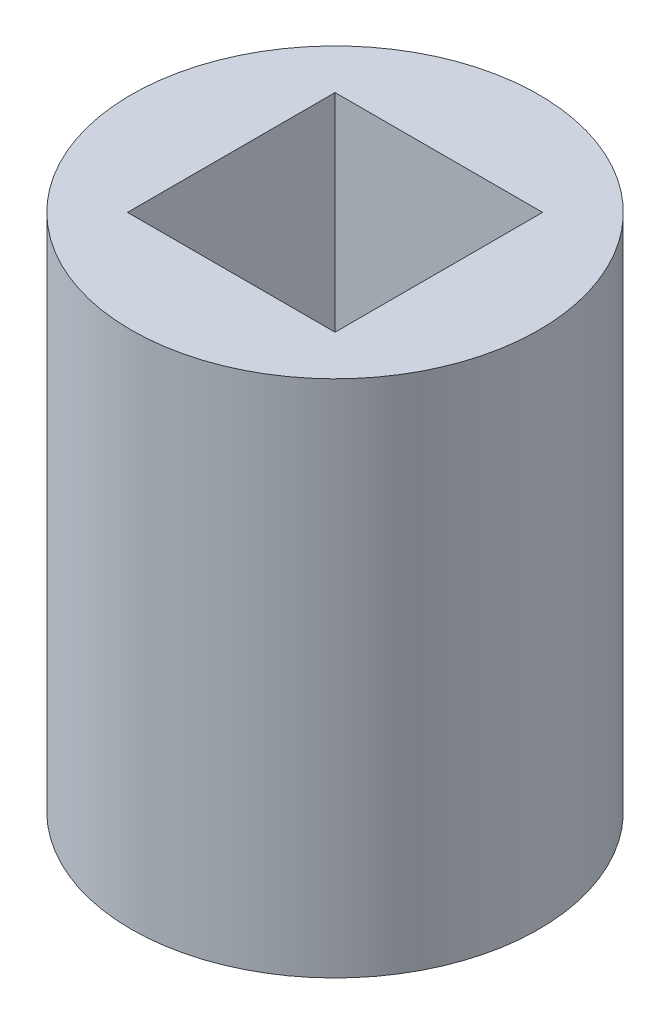
ISO-10303-21;
HEADER;
FILE_DESCRIPTION(('STEP AP214'),'2;1');
FILE_NAME('part.step','',(''),(''),'','','');
FILE_SCHEMA(('AUTOMOTIVE_DESIGN { 1 0 10303 214 1 1 1 1 }'));
ENDSEC;
DATA;
#1=APPLICATION_CONTEXT('core data for automotive mechanical design processes');
#2=APPLICATION_PROTOCOL_DEFINITION('international standard','automotive_design',2000,#1);
#3=PRODUCT_CONTEXT('',#1,'mechanical');
#4=PRODUCT('Part','Part','',(#3));
#5=PRODUCT_RELATED_PRODUCT_CATEGORY('part','',(#4));
#6=PRODUCT_DEFINITION_FORMATION('','',#4);
#7=PRODUCT_DEFINITION_CONTEXT('part definition',#1,'design');
#8=PRODUCT_DEFINITION('design','',#6,#7);
#9=PRODUCT_DEFINITION_SHAPE('','',#8);
#10=(LENGTH_UNIT() NAMED_UNIT(*) SI_UNIT(.MILLI.,.METRE.));
#11=(NAMED_UNIT(*) PLANE_ANGLE_UNIT() SI_UNIT($,.RADIAN.));
#12=(NAMED_UNIT(*) SI_UNIT($,.STERADIAN.) SOLID_ANGLE_UNIT());
#13=UNCERTAINTY_MEASURE_WITH_UNIT(LENGTH_MEASURE(1.E-05),#10,'distance_accuracy_value','');
#14=(GEOMETRIC_REPRESENTATION_CONTEXT(3) GLOBAL_UNCERTAINTY_ASSIGNED_CONTEXT((#13)) GLOBAL_UNIT_ASSIGNED_CONTEXT((#10,
#11,#12)) REPRESENTATION_CONTEXT('',''));
#15=CARTESIAN_POINT('',(0.,0.,0.));
#16=DIRECTION('',(0.,0.,1.));
#17=DIRECTION('',(1.,0.,0.));
#18=AXIS2_PLACEMENT_3D('',#15,#16,#17);
#19=CARTESIAN_POINT('',(0.,14.,0.));
#20=DIRECTION('',(0.,-1.,0.));
#21=DIRECTION('',(0.,0.,-1.));
#22=AXIS2_PLACEMENT_3D('',#19,#20,#21);
#23=CYLINDRICAL_SURFACE('',#22,5.5);
#24=CARTESIAN_POINT('',(0.,14.,0.));
#25=DIRECTION('',(0.,1.,0.));
#26=DIRECTION('',(0.,0.,1.));
#27=AXIS2_PLACEMENT_3D('',#24,#25,#26);
#28=CIRCLE('',#27,5.5);
#29=CARTESIAN_POINT('',(0.,14.,5.5));
#30=VERTEX_POINT('',#29);
#31=EDGE_CURVE('E11',#30,#30,#28,.T.);
#32=ORIENTED_EDGE('',*,*,#31,.F.);
#33=EDGE_LOOP('',(#32));
#34=FACE_BOUND('',#33,.T.);
#35=CARTESIAN_POINT('',(0.,0.,0.));
#36=DIRECTION('',(0.,1.,0.));
#37=DIRECTION('',(0.,0.,1.));
#38=AXIS2_PLACEMENT_3D('',#35,#36,#37);
#39=CIRCLE('',#38,5.5);
#40=CARTESIAN_POINT('',(0.,0.,5.5));
#41=VERTEX_POINT('',#40);
#42=EDGE_CURVE('E39',#41,#41,#39,.T.);
#43=ORIENTED_EDGE('',*,*,#42,.T.);
#44=EDGE_LOOP('',(#43));
#45=FACE_BOUND('',#44,.T.);
#46=ADVANCED_FACE('F36',(#34,#45),#23,.T.);
#47=CARTESIAN_POINT('',(0.,14.,0.));
#48=DIRECTION('',(0.,1.,0.));
#49=DIRECTION('',(0.,0.,1.));
#50=AXIS2_PLACEMENT_3D('',#47,#48,#49);
#51=PLANE('',#50);
#52=DIRECTION('',(0.,0.,-1.));
#53=VECTOR('',#52,1.);
#54=CARTESIAN_POINT('',(2.8,14.,2.8));
#55=LINE('',#54,#53);
#56=CARTESIAN_POINT('',(2.8,14.,2.8));
#57=VERTEX_POINT('',#56);
#58=CARTESIAN_POINT('',(2.8,14.,-2.8));
#59=VERTEX_POINT('',#58);
#60=EDGE_CURVE('E50',#57,#59,#55,.T.);
#61=ORIENTED_EDGE('',*,*,#60,.F.);
#62=DIRECTION('',(1.,0.,0.));
#63=VECTOR('',#62,1.);
#64=CARTESIAN_POINT('',(-2.8,14.,2.8));
#65=LINE('',#64,#63);
#66=CARTESIAN_POINT('',(-2.8,14.,2.8));
#67=VERTEX_POINT('',#66);
#68=EDGE_CURVE('E101',#67,#57,#65,.T.);
#69=ORIENTED_EDGE('',*,*,#68,.F.);
#70=DIRECTION('',(0.,0.,1.));
#71=VECTOR('',#70,1.);
#72=CARTESIAN_POINT('',(-2.8,14.,2.8));
#73=LINE('',#72,#71);
#74=CARTESIAN_POINT('',(-2.8,14.,-2.8));
#75=VERTEX_POINT('',#74);
#76=EDGE_CURVE('E107',#75,#67,#73,.T.);
#77=ORIENTED_EDGE('',*,*,#76,.F.);
#78=DIRECTION('',(-1.,0.,0.));
#79=VECTOR('',#78,1.);
#80=CARTESIAN_POINT('',(-2.8,14.,-2.8));
#81=LINE('',#80,#79);
#82=EDGE_CURVE('E85',#59,#75,#81,.T.);
#83=ORIENTED_EDGE('',*,*,#82,.F.);
#84=EDGE_LOOP('',(#61,#69,#77,#83));
#85=FACE_BOUND('',#84,.T.);
#86=ORIENTED_EDGE('',*,*,#31,.T.);
#87=EDGE_LOOP('',(#86));
#88=FACE_BOUND('',#87,.T.);
#89=ADVANCED_FACE('F113',(#85,#88),#51,.T.);
#90=CARTESIAN_POINT('',(0.,0.,0.));
#91=DIRECTION('',(0.,1.,0.));
#92=DIRECTION('',(0.,0.,1.));
#93=AXIS2_PLACEMENT_3D('',#90,#91,#92);
#94=PLANE('',#93);
#95=ORIENTED_EDGE('',*,*,#42,.F.);
#96=EDGE_LOOP('',(#95));
#97=FACE_BOUND('',#96,.T.);
#98=ADVANCED_FACE('F125',(#97),#94,.F.);
#99=CARTESIAN_POINT('',(2.8,6.,2.8));
#100=DIRECTION('',(1.,0.,0.));
#101=DIRECTION('',(0.,0.,-1.));
#102=AXIS2_PLACEMENT_3D('',#99,#100,#101);
#103=PLANE('',#102);
#104=ORIENTED_EDGE('',*,*,#60,.T.);
#105=DIRECTION('',(0.,1.,0.));
#106=VECTOR('',#105,1.);
#107=CARTESIAN_POINT('',(2.8,6.,-2.8));
#108=LINE('',#107,#106);
#109=CARTESIAN_POINT('',(2.8,6.,-2.8));
#110=VERTEX_POINT('',#109);
#111=EDGE_CURVE('E73',#110,#59,#108,.T.);
#112=ORIENTED_EDGE('',*,*,#111,.F.);
#113=DIRECTION('',(0.,0.,-1.));
#114=VECTOR('',#113,1.);
#115=CARTESIAN_POINT('',(2.8,6.,2.8));
#116=LINE('',#115,#114);
#117=CARTESIAN_POINT('',(2.8,6.,2.8));
#118=VERTEX_POINT('',#117);
#119=EDGE_CURVE('E99',#118,#110,#116,.T.);
#120=ORIENTED_EDGE('',*,*,#119,.F.);
#121=DIRECTION('',(0.,1.,0.));
#122=VECTOR('',#121,1.);
#123=CARTESIAN_POINT('',(2.8,6.,2.8));
#124=LINE('',#123,#122);
#125=EDGE_CURVE('E58',#118,#57,#124,.T.);
#126=ORIENTED_EDGE('',*,*,#125,.T.);
#127=EDGE_LOOP('',(#104,#112,#120,#126));
#128=FACE_BOUND('',#127,.T.);
#129=ADVANCED_FACE('F118',(#128),#103,.F.);
#130=CARTESIAN_POINT('',(-2.8,6.,2.8));
#131=DIRECTION('',(0.,0.,1.));
#132=DIRECTION('',(1.,0.,0.));
#133=AXIS2_PLACEMENT_3D('',#130,#131,#132);
#134=PLANE('',#133);
#135=ORIENTED_EDGE('',*,*,#68,.T.);
#136=ORIENTED_EDGE('',*,*,#125,.F.);
#137=DIRECTION('',(1.,0.,0.));
#138=VECTOR('',#137,1.);
#139=CARTESIAN_POINT('',(-2.8,6.,2.8));
#140=LINE('',#139,#138);
#141=CARTESIAN_POINT('',(-2.8,6.,2.8));
#142=VERTEX_POINT('',#141);
#143=EDGE_CURVE('E96',#142,#118,#140,.T.);
#144=ORIENTED_EDGE('',*,*,#143,.F.);
#145=DIRECTION('',(0.,1.,0.));
#146=VECTOR('',#145,1.);
#147=CARTESIAN_POINT('',(-2.8,6.,2.8));
#148=LINE('',#147,#146);
#149=EDGE_CURVE('E89',#142,#67,#148,.T.);
#150=ORIENTED_EDGE('',*,*,#149,.T.);
#151=EDGE_LOOP('',(#135,#136,#144,#150));
#152=FACE_BOUND('',#151,.T.);
#153=ADVANCED_FACE('F116',(#152),#134,.F.);
#154=CARTESIAN_POINT('',(-2.8,6.,2.8));
#155=DIRECTION('',(-1.,0.,0.));
#156=DIRECTION('',(0.,0.,1.));
#157=AXIS2_PLACEMENT_3D('',#154,#155,#156);
#158=PLANE('',#157);
#159=ORIENTED_EDGE('',*,*,#76,.T.);
#160=ORIENTED_EDGE('',*,*,#149,.F.);
#161=DIRECTION('',(0.,0.,1.));
#162=VECTOR('',#161,1.);
#163=CARTESIAN_POINT('',(-2.8,6.,2.8));
#164=LINE('',#163,#162);
#165=CARTESIAN_POINT('',(-2.8,6.,-2.8));
#166=VERTEX_POINT('',#165);
#167=EDGE_CURVE('E92',#166,#142,#164,.T.);
#168=ORIENTED_EDGE('',*,*,#167,.F.);
#169=DIRECTION('',(0.,1.,0.));
#170=VECTOR('',#169,1.);
#171=CARTESIAN_POINT('',(-2.8,6.,-2.8));
#172=LINE('',#171,#170);
#173=EDGE_CURVE('E78',#166,#75,#172,.T.);
#174=ORIENTED_EDGE('',*,*,#173,.T.);
#175=EDGE_LOOP('',(#159,#160,#168,#174));
#176=FACE_BOUND('',#175,.T.);
#177=ADVANCED_FACE('F93',(#176),#158,.F.);
#178=CARTESIAN_POINT('',(-2.8,6.,-2.8));
#179=DIRECTION('',(0.,0.,-1.));
#180=DIRECTION('',(-1.,0.,0.));
#181=AXIS2_PLACEMENT_3D('',#178,#179,#180);
#182=PLANE('',#181);
#183=ORIENTED_EDGE('',*,*,#82,.T.);
#184=ORIENTED_EDGE('',*,*,#173,.F.);
#185=DIRECTION('',(-1.,0.,0.));
#186=VECTOR('',#185,1.);
#187=CARTESIAN_POINT('',(-2.8,6.,-2.8));
#188=LINE('',#187,#186);
#189=EDGE_CURVE('E82',#110,#166,#188,.T.);
#190=ORIENTED_EDGE('',*,*,#189,.F.);
#191=ORIENTED_EDGE('',*,*,#111,.T.);
#192=EDGE_LOOP('',(#183,#184,#190,#191));
#193=FACE_BOUND('',#192,.T.);
#194=ADVANCED_FACE('F80',(#193),#182,.F.);
#195=CARTESIAN_POINT('',(0.,6.,0.));
#196=DIRECTION('',(0.,-1.,0.));
#197=DIRECTION('',(0.,0.,-1.));
#198=AXIS2_PLACEMENT_3D('',#195,#196,#197);
#199=PLANE('',#198);
#200=ORIENTED_EDGE('',*,*,#119,.T.);
#201=ORIENTED_EDGE('',*,*,#189,.T.);
#202=ORIENTED_EDGE('',*,*,#167,.T.);
#203=ORIENTED_EDGE('',*,*,#143,.T.);
#204=EDGE_LOOP('',(#200,#201,#202,#203));
#205=FACE_BOUND('',#204,.T.);
#206=ADVANCED_FACE('F98',(#205),#199,.F.);
#207=CLOSED_SHELL('',(#46,#89,#98,#129,#153,#177,#194,#206));
#208=MANIFOLD_SOLID_BREP('B2',#207);
#209=ADVANCED_BREP_SHAPE_REPRESENTATION('',(#18,#208),#14);
#210=SHAPE_DEFINITION_REPRESENTATION(#9,#209);
ENDSEC;
END-ISO-10303-21;
